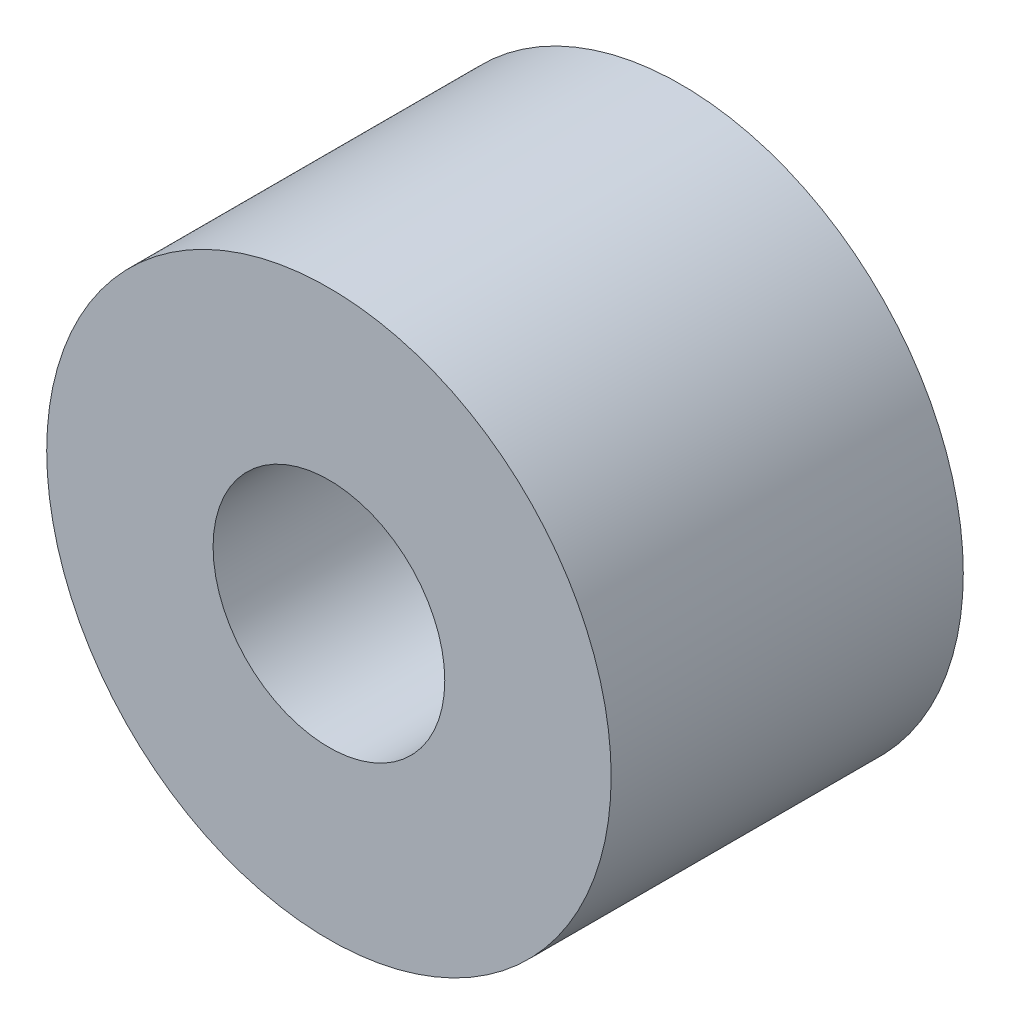
ISO-10303-21;
HEADER;
FILE_DESCRIPTION(('STEP AP214'),'2;1');
FILE_NAME('part.step','',(''),(''),'','','');
FILE_SCHEMA(('AUTOMOTIVE_DESIGN { 1 0 10303 214 1 1 1 1 }'));
ENDSEC;
DATA;
#1=APPLICATION_CONTEXT('core data for automotive mechanical design processes');
#2=APPLICATION_PROTOCOL_DEFINITION('international standard','automotive_design',2000,#1);
#3=PRODUCT_CONTEXT('',#1,'mechanical');
#4=PRODUCT('Part','Part','',(#3));
#5=PRODUCT_RELATED_PRODUCT_CATEGORY('part','',(#4));
#6=PRODUCT_DEFINITION_FORMATION('','',#4);
#7=PRODUCT_DEFINITION_CONTEXT('part definition',#1,'design');
#8=PRODUCT_DEFINITION('design','',#6,#7);
#9=PRODUCT_DEFINITION_SHAPE('','',#8);
#10=(LENGTH_UNIT() NAMED_UNIT(*) SI_UNIT(.MILLI.,.METRE.));
#11=(NAMED_UNIT(*) PLANE_ANGLE_UNIT() SI_UNIT($,.RADIAN.));
#12=(NAMED_UNIT(*) SI_UNIT($,.STERADIAN.) SOLID_ANGLE_UNIT());
#13=UNCERTAINTY_MEASURE_WITH_UNIT(LENGTH_MEASURE(1.E-05),#10,'distance_accuracy_value','');
#14=(GEOMETRIC_REPRESENTATION_CONTEXT(3) GLOBAL_UNCERTAINTY_ASSIGNED_CONTEXT((#13)) GLOBAL_UNIT_ASSIGNED_CONTEXT((#10,
#11,#12)) REPRESENTATION_CONTEXT('',''));
#15=CARTESIAN_POINT('',(0.,0.,0.));
#16=DIRECTION('',(0.,0.,1.));
#17=DIRECTION('',(1.,0.,0.));
#18=AXIS2_PLACEMENT_3D('',#15,#16,#17);
#19=CARTESIAN_POINT('',(69.1708200187509,22.8308389478516,10.7));
#20=DIRECTION('',(0.,0.,1.));
#21=DIRECTION('',(1.,0.,0.));
#22=AXIS2_PLACEMENT_3D('',#19,#20,#21);
#23=PLANE('',#22);
#24=CARTESIAN_POINT('',(69.1708200187509,22.8308389478516,10.7));
#25=DIRECTION('',(0.,0.,1.));
#26=DIRECTION('',(1.,0.,0.));
#27=AXIS2_PLACEMENT_3D('',#24,#25,#26);
#28=CIRCLE('',#27,8.57589848642401);
#29=CARTESIAN_POINT('',(77.7467185051749,22.8308389478516,10.7));
#30=VERTEX_POINT('',#29);
#31=EDGE_CURVE('E10',#30,#30,#28,.T.);
#32=ORIENTED_EDGE('',*,*,#31,.T.);
#33=EDGE_LOOP('',(#32));
#34=FACE_BOUND('',#33,.T.);
#35=CARTESIAN_POINT('',(69.1708200187509,22.8308389478516,10.7));
#36=DIRECTION('',(0.,0.,1.));
#37=DIRECTION('',(1.,0.,0.));
#38=AXIS2_PLACEMENT_3D('',#35,#36,#37);
#39=CIRCLE('',#38,3.52023358157802);
#40=CARTESIAN_POINT('',(72.6910536003289,22.8308389478516,10.7));
#41=VERTEX_POINT('',#40);
#42=EDGE_CURVE('E46',#41,#41,#39,.T.);
#43=ORIENTED_EDGE('',*,*,#42,.F.);
#44=EDGE_LOOP('',(#43));
#45=FACE_BOUND('',#44,.T.);
#46=ADVANCED_FACE('F35',(#34,#45),#23,.T.);
#47=CARTESIAN_POINT('',(69.1708200187509,22.8308389478516,0.));
#48=DIRECTION('',(0.,0.,1.));
#49=DIRECTION('',(1.,0.,0.));
#50=AXIS2_PLACEMENT_3D('',#47,#48,#49);
#51=PLANE('',#50);
#52=CARTESIAN_POINT('',(69.1708200187509,22.8308389478516,0.));
#53=DIRECTION('',(0.,0.,1.));
#54=DIRECTION('',(1.,0.,0.));
#55=AXIS2_PLACEMENT_3D('',#52,#53,#54);
#56=CIRCLE('',#55,8.57589848642401);
#57=CARTESIAN_POINT('',(77.7467185051749,22.8308389478516,0.));
#58=VERTEX_POINT('',#57);
#59=EDGE_CURVE('E39',#58,#58,#56,.T.);
#60=ORIENTED_EDGE('',*,*,#59,.F.);
#61=EDGE_LOOP('',(#60));
#62=FACE_BOUND('',#61,.T.);
#63=CARTESIAN_POINT('',(69.1708200187509,22.8308389478516,0.));
#64=DIRECTION('',(0.,0.,1.));
#65=DIRECTION('',(1.,0.,0.));
#66=AXIS2_PLACEMENT_3D('',#63,#64,#65);
#67=CIRCLE('',#66,3.52023358157802);
#68=CARTESIAN_POINT('',(72.6910536003289,22.8308389478516,0.));
#69=VERTEX_POINT('',#68);
#70=EDGE_CURVE('E48',#69,#69,#67,.T.);
#71=ORIENTED_EDGE('',*,*,#70,.T.);
#72=EDGE_LOOP('',(#71));
#73=FACE_BOUND('',#72,.T.);
#74=ADVANCED_FACE('F58',(#62,#73),#51,.F.);
#75=CARTESIAN_POINT('',(69.1708200187509,22.8308389478516,10.7));
#76=DIRECTION('',(0.,0.,-1.));
#77=DIRECTION('',(-1.,0.,0.));
#78=AXIS2_PLACEMENT_3D('',#75,#76,#77);
#79=CYLINDRICAL_SURFACE('',#78,8.57589848642401);
#80=ORIENTED_EDGE('',*,*,#31,.F.);
#81=EDGE_LOOP('',(#80));
#82=FACE_BOUND('',#81,.T.);
#83=ORIENTED_EDGE('',*,*,#59,.T.);
#84=EDGE_LOOP('',(#83));
#85=FACE_BOUND('',#84,.T.);
#86=ADVANCED_FACE('F37',(#82,#85),#79,.T.);
#87=CARTESIAN_POINT('',(69.1708200187509,22.8308389478516,10.7));
#88=DIRECTION('',(0.,0.,-1.));
#89=DIRECTION('',(-1.,0.,0.));
#90=AXIS2_PLACEMENT_3D('',#87,#88,#89);
#91=CYLINDRICAL_SURFACE('',#90,3.52023358157802);
#92=ORIENTED_EDGE('',*,*,#42,.T.);
#93=EDGE_LOOP('',(#92));
#94=FACE_BOUND('',#93,.T.);
#95=ORIENTED_EDGE('',*,*,#70,.F.);
#96=EDGE_LOOP('',(#95));
#97=FACE_BOUND('',#96,.T.);
#98=ADVANCED_FACE('F54',(#94,#97),#91,.F.);
#99=CLOSED_SHELL('',(#46,#74,#86,#98));
#100=MANIFOLD_SOLID_BREP('B2',#99);
#101=ADVANCED_BREP_SHAPE_REPRESENTATION('',(#18,#100),#14);
#102=SHAPE_DEFINITION_REPRESENTATION(#9,#101);
ENDSEC;
END-ISO-10303-21;
